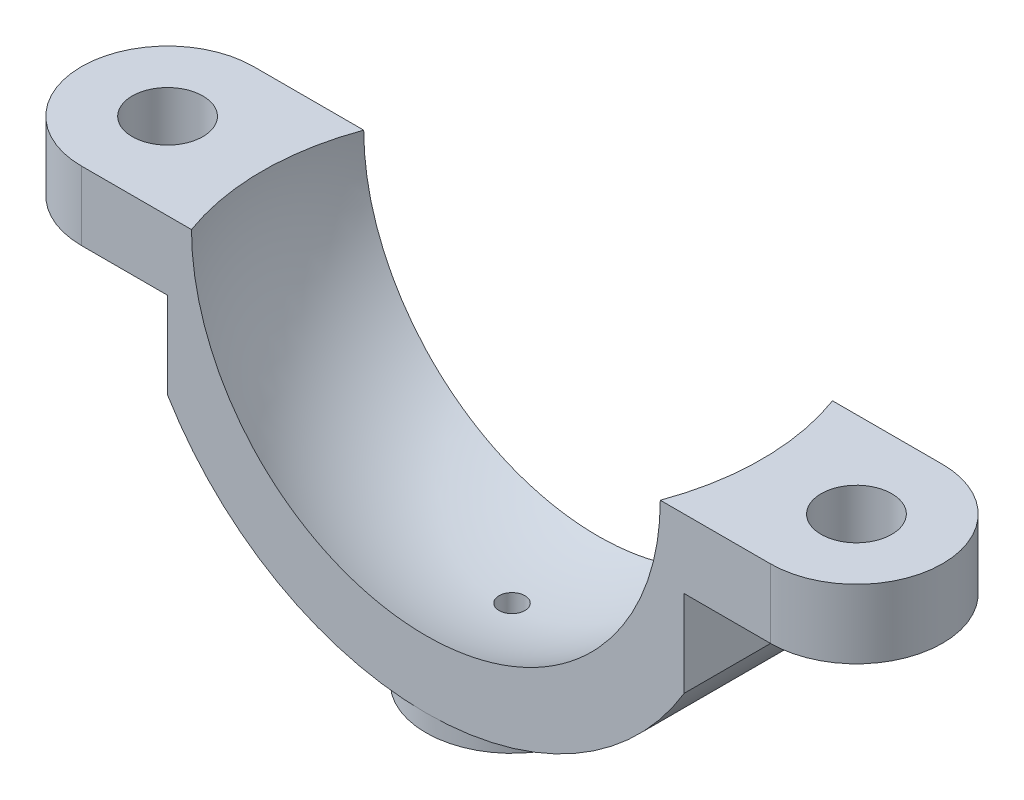
ISO-10303-21;
HEADER;
FILE_DESCRIPTION(('STEP AP214'),'2;1');
FILE_NAME('part.step','',(''),(''),'','','');
FILE_SCHEMA(('AUTOMOTIVE_DESIGN { 1 0 10303 214 1 1 1 1 }'));
ENDSEC;
DATA;
#1=APPLICATION_CONTEXT('core data for automotive mechanical design processes');
#2=APPLICATION_PROTOCOL_DEFINITION('international standard','automotive_design',2000,#1);
#3=PRODUCT_CONTEXT('',#1,'mechanical');
#4=PRODUCT('Part','Part','',(#3));
#5=PRODUCT_RELATED_PRODUCT_CATEGORY('part','',(#4));
#6=PRODUCT_DEFINITION_FORMATION('','',#4);
#7=PRODUCT_DEFINITION_CONTEXT('part definition',#1,'design');
#8=PRODUCT_DEFINITION('design','',#6,#7);
#9=PRODUCT_DEFINITION_SHAPE('','',#8);
#10=(LENGTH_UNIT() NAMED_UNIT(*) SI_UNIT(.MILLI.,.METRE.));
#11=(NAMED_UNIT(*) PLANE_ANGLE_UNIT() SI_UNIT($,.RADIAN.));
#12=(NAMED_UNIT(*) SI_UNIT($,.STERADIAN.) SOLID_ANGLE_UNIT());
#13=UNCERTAINTY_MEASURE_WITH_UNIT(LENGTH_MEASURE(1.E-05),#10,'distance_accuracy_value','');
#14=(GEOMETRIC_REPRESENTATION_CONTEXT(3) GLOBAL_UNCERTAINTY_ASSIGNED_CONTEXT((#13)) GLOBAL_UNIT_ASSIGNED_CONTEXT((#10,
#11,#12)) REPRESENTATION_CONTEXT('',''));
#15=CARTESIAN_POINT('',(0.,0.,0.));
#16=DIRECTION('',(0.,0.,1.));
#17=DIRECTION('',(1.,0.,0.));
#18=AXIS2_PLACEMENT_3D('',#15,#16,#17);
#19=CARTESIAN_POINT('',(0.,-40.,10.));
#20=DIRECTION('',(0.,0.,1.));
#21=DIRECTION('',(1.,0.,0.));
#22=AXIS2_PLACEMENT_3D('',#19,#20,#21);
#23=PLANE('',#22);
#24=DIRECTION('',(0.,-1.,0.));
#25=VECTOR('',#24,1.);
#26=CARTESIAN_POINT('',(30.,28.2842712474619,10.));
#27=LINE('',#26,#25);
#28=CARTESIAN_POINT('',(30.,-8.,10.));
#29=VERTEX_POINT('',#28);
#30=CARTESIAN_POINT('',(30.,-18.02775637732,10.));
#31=VERTEX_POINT('',#30);
#32=EDGE_CURVE('E183',#29,#31,#27,.T.);
#33=ORIENTED_EDGE('',*,*,#32,.F.);
#34=DIRECTION('',(-1.,0.,0.));
#35=VECTOR('',#34,1.);
#36=CARTESIAN_POINT('',(40.,-8.,10.));
#37=LINE('',#36,#35);
#38=CARTESIAN_POINT('',(40.,-8.,10.));
#39=VERTEX_POINT('',#38);
#40=EDGE_CURVE('E195',#39,#29,#37,.T.);
#41=ORIENTED_EDGE('',*,*,#40,.F.);
#42=DIRECTION('',(0.,1.,0.));
#43=VECTOR('',#42,1.);
#44=CARTESIAN_POINT('',(40.,-40.,10.));
#45=LINE('',#44,#43);
#46=CARTESIAN_POINT('',(40.,0.,10.));
#47=VERTEX_POINT('',#46);
#48=EDGE_CURVE('E264',#39,#47,#45,.T.);
#49=ORIENTED_EDGE('',*,*,#48,.T.);
#50=DIRECTION('',(1.,0.,0.));
#51=VECTOR('',#50,1.);
#52=CARTESIAN_POINT('',(0.,0.,10.));
#53=LINE('',#52,#51);
#54=CARTESIAN_POINT('',(27.2213151776324,0.,10.));
#55=VERTEX_POINT('',#54);
#56=EDGE_CURVE('E261',#55,#47,#53,.T.);
#57=ORIENTED_EDGE('',*,*,#56,.F.);
#58=CARTESIAN_POINT('',(0.,0.,10.));
#59=DIRECTION('',(0.,0.,-1.));
#60=DIRECTION('',(-1.,0.,0.));
#61=AXIS2_PLACEMENT_3D('',#58,#59,#60);
#62=CIRCLE('',#61,27.2213151776324);
#63=CARTESIAN_POINT('',(-27.2213151776324,0.,10.));
#64=VERTEX_POINT('',#63);
#65=EDGE_CURVE('E200',#64,#55,#62,.F.);
#66=ORIENTED_EDGE('',*,*,#65,.F.);
#67=DIRECTION('',(-1.,0.,0.));
#68=VECTOR('',#67,1.);
#69=CARTESIAN_POINT('',(0.,0.,10.));
#70=LINE('',#69,#68);
#71=CARTESIAN_POINT('',(-40.,0.,10.));
#72=VERTEX_POINT('',#71);
#73=EDGE_CURVE('E107',#64,#72,#70,.T.);
#74=ORIENTED_EDGE('',*,*,#73,.T.);
#75=DIRECTION('',(0.,1.,0.));
#76=VECTOR('',#75,1.);
#77=CARTESIAN_POINT('',(-40.,-40.,10.));
#78=LINE('',#77,#76);
#79=CARTESIAN_POINT('',(-40.,-8.,10.));
#80=VERTEX_POINT('',#79);
#81=EDGE_CURVE('E246',#80,#72,#78,.T.);
#82=ORIENTED_EDGE('',*,*,#81,.F.);
#83=DIRECTION('',(1.,0.,0.));
#84=VECTOR('',#83,1.);
#85=CARTESIAN_POINT('',(-40.,-8.,10.));
#86=LINE('',#85,#84);
#87=CARTESIAN_POINT('',(-30.,-8.,10.));
#88=VERTEX_POINT('',#87);
#89=EDGE_CURVE('E227',#80,#88,#86,.T.);
#90=ORIENTED_EDGE('',*,*,#89,.T.);
#91=DIRECTION('',(0.,-1.,0.));
#92=VECTOR('',#91,1.);
#93=CARTESIAN_POINT('',(-30.,28.2842712474619,10.));
#94=LINE('',#93,#92);
#95=CARTESIAN_POINT('',(-30.,-18.02775637732,10.));
#96=VERTEX_POINT('',#95);
#97=EDGE_CURVE('E224',#88,#96,#94,.T.);
#98=ORIENTED_EDGE('',*,*,#97,.T.);
#99=CARTESIAN_POINT('',(0.,0.,10.));
#100=DIRECTION('',(0.,0.,-1.));
#101=DIRECTION('',(-1.,0.,0.));
#102=AXIS2_PLACEMENT_3D('',#99,#100,#101);
#103=CIRCLE('',#102,35.);
#104=CARTESIAN_POINT('',(0.,-35.,10.));
#105=VERTEX_POINT('',#104);
#106=EDGE_CURVE('E205',#105,#96,#103,.T.);
#107=ORIENTED_EDGE('',*,*,#106,.F.);
#108=EDGE_CURVE('E209',#31,#105,#103,.T.);
#109=ORIENTED_EDGE('',*,*,#108,.F.);
#110=EDGE_LOOP('',(#33,#41,#49,#57,#66,#74,#82,#90,#98,#107,#109));
#111=FACE_BOUND('',#110,.T.);
#112=ADVANCED_FACE('F85',(#111),#23,.T.);
#113=CARTESIAN_POINT('',(0.,-40.,-10.));
#114=DIRECTION('',(0.,0.,-1.));
#115=DIRECTION('',(-1.,0.,0.));
#116=AXIS2_PLACEMENT_3D('',#113,#114,#115);
#117=PLANE('',#116);
#118=DIRECTION('',(1.,0.,0.));
#119=VECTOR('',#118,1.);
#120=CARTESIAN_POINT('',(30.,-8.,-10.));
#121=LINE('',#120,#119);
#122=CARTESIAN_POINT('',(30.,-8.,-10.));
#123=VERTEX_POINT('',#122);
#124=CARTESIAN_POINT('',(40.,-8.,-10.));
#125=VERTEX_POINT('',#124);
#126=EDGE_CURVE('E182',#123,#125,#121,.T.);
#127=ORIENTED_EDGE('',*,*,#126,.F.);
#128=DIRECTION('',(0.,-1.,0.));
#129=VECTOR('',#128,1.);
#130=CARTESIAN_POINT('',(30.,28.2842712474619,-10.));
#131=LINE('',#130,#129);
#132=CARTESIAN_POINT('',(30.,-18.02775637732,-10.));
#133=VERTEX_POINT('',#132);
#134=EDGE_CURVE('E171',#123,#133,#131,.T.);
#135=ORIENTED_EDGE('',*,*,#134,.T.);
#136=CARTESIAN_POINT('',(0.,0.,-10.));
#137=DIRECTION('',(0.,0.,1.));
#138=DIRECTION('',(1.,0.,0.));
#139=AXIS2_PLACEMENT_3D('',#136,#137,#138);
#140=CIRCLE('',#139,35.);
#141=CARTESIAN_POINT('',(0.,-35.,-10.));
#142=VERTEX_POINT('',#141);
#143=EDGE_CURVE('E213',#142,#133,#140,.T.);
#144=ORIENTED_EDGE('',*,*,#143,.F.);
#145=CARTESIAN_POINT('',(-30.,-18.02775637732,-10.));
#146=VERTEX_POINT('',#145);
#147=EDGE_CURVE('E210',#146,#142,#140,.T.);
#148=ORIENTED_EDGE('',*,*,#147,.F.);
#149=DIRECTION('',(0.,-1.,0.));
#150=VECTOR('',#149,1.);
#151=CARTESIAN_POINT('',(-30.,28.2842712474619,-10.));
#152=LINE('',#151,#150);
#153=CARTESIAN_POINT('',(-30.,-8.,-10.));
#154=VERTEX_POINT('',#153);
#155=EDGE_CURVE('E237',#154,#146,#152,.T.);
#156=ORIENTED_EDGE('',*,*,#155,.F.);
#157=DIRECTION('',(-1.,0.,0.));
#158=VECTOR('',#157,1.);
#159=CARTESIAN_POINT('',(-30.,-8.,-10.));
#160=LINE('',#159,#158);
#161=CARTESIAN_POINT('',(-40.,-8.,-10.));
#162=VERTEX_POINT('',#161);
#163=EDGE_CURVE('E234',#154,#162,#160,.T.);
#164=ORIENTED_EDGE('',*,*,#163,.T.);
#165=DIRECTION('',(0.,1.,0.));
#166=VECTOR('',#165,1.);
#167=CARTESIAN_POINT('',(-40.,-40.,-10.));
#168=LINE('',#167,#166);
#169=CARTESIAN_POINT('',(-40.,0.,-10.));
#170=VERTEX_POINT('',#169);
#171=EDGE_CURVE('E247',#162,#170,#168,.T.);
#172=ORIENTED_EDGE('',*,*,#171,.T.);
#173=DIRECTION('',(1.,0.,0.));
#174=VECTOR('',#173,1.);
#175=CARTESIAN_POINT('',(0.,0.,-10.));
#176=LINE('',#175,#174);
#177=CARTESIAN_POINT('',(-27.2213151776324,0.,-10.));
#178=VERTEX_POINT('',#177);
#179=EDGE_CURVE('E244',#170,#178,#176,.T.);
#180=ORIENTED_EDGE('',*,*,#179,.T.);
#181=CARTESIAN_POINT('',(0.,0.,-10.));
#182=DIRECTION('',(0.,0.,1.));
#183=DIRECTION('',(1.,0.,0.));
#184=AXIS2_PLACEMENT_3D('',#181,#182,#183);
#185=CIRCLE('',#184,27.2213151776324);
#186=CARTESIAN_POINT('',(27.2213151776324,0.,-10.));
#187=VERTEX_POINT('',#186);
#188=EDGE_CURVE('E208',#187,#178,#185,.F.);
#189=ORIENTED_EDGE('',*,*,#188,.F.);
#190=DIRECTION('',(-1.,0.,0.));
#191=VECTOR('',#190,1.);
#192=CARTESIAN_POINT('',(0.,0.,-10.));
#193=LINE('',#192,#191);
#194=CARTESIAN_POINT('',(40.,0.,-10.));
#195=VERTEX_POINT('',#194);
#196=EDGE_CURVE('E100',#195,#187,#193,.T.);
#197=ORIENTED_EDGE('',*,*,#196,.F.);
#198=DIRECTION('',(0.,1.,0.));
#199=VECTOR('',#198,1.);
#200=CARTESIAN_POINT('',(40.,-40.,-10.));
#201=LINE('',#200,#199);
#202=EDGE_CURVE('E187',#125,#195,#201,.T.);
#203=ORIENTED_EDGE('',*,*,#202,.F.);
#204=EDGE_LOOP('',(#127,#135,#144,#148,#156,#164,#172,#180,#189,#197,#203));
#205=FACE_BOUND('',#204,.T.);
#206=ADVANCED_FACE('F186',(#205),#117,.T.);
#207=CARTESIAN_POINT('',(0.,0.,0.));
#208=DIRECTION('',(0.,-1.,0.));
#209=DIRECTION('',(-1.,0.,0.));
#210=AXIS2_PLACEMENT_3D('',#207,#208,#209);
#211=SPHERICAL_SURFACE('',#210,29.);
#212=CARTESIAN_POINT('',(0.,-28.9611809151492,0.));
#213=DIRECTION('',(0.,1.,0.));
#214=DIRECTION('',(0.,0.,1.));
#215=AXIS2_PLACEMENT_3D('',#212,#213,#214);
#216=CIRCLE('',#215,1.5);
#217=CARTESIAN_POINT('',(0.,-28.9611809151492,1.5));
#218=VERTEX_POINT('',#217);
#219=EDGE_CURVE('E197',#218,#218,#216,.F.);
#220=ORIENTED_EDGE('',*,*,#219,.T.);
#221=EDGE_LOOP('',(#220));
#222=FACE_BOUND('',#221,.T.);
#223=CARTESIAN_POINT('',(0.,0.,0.));
#224=DIRECTION('',(0.,1.,0.));
#225=DIRECTION('',(0.,0.,1.));
#226=AXIS2_PLACEMENT_3D('',#223,#224,#225);
#227=CIRCLE('',#226,29.);
#228=EDGE_CURVE('E13',#64,#178,#227,.F.);
#229=ORIENTED_EDGE('',*,*,#228,.F.);
#230=ORIENTED_EDGE('',*,*,#65,.T.);
#231=EDGE_CURVE('E89',#187,#55,#227,.F.);
#232=ORIENTED_EDGE('',*,*,#231,.F.);
#233=ORIENTED_EDGE('',*,*,#188,.T.);
#234=EDGE_LOOP('',(#229,#230,#232,#233));
#235=FACE_BOUND('',#234,.T.);
#236=ADVANCED_FACE('F320',(#222,#235),#211,.F.);
#237=CARTESIAN_POINT('',(0.,0.,19.));
#238=DIRECTION('',(0.,0.,-1.));
#239=DIRECTION('',(-1.,0.,0.));
#240=AXIS2_PLACEMENT_3D('',#237,#238,#239);
#241=CYLINDRICAL_SURFACE('',#240,35.);
#242=DIRECTION('',(0.,0.,-1.));
#243=VECTOR('',#242,1.);
#244=CARTESIAN_POINT('',(30.,-18.02775637732,19.));
#245=LINE('',#244,#243);
#246=EDGE_CURVE('E178',#133,#31,#245,.F.);
#247=ORIENTED_EDGE('',*,*,#246,.T.);
#248=ORIENTED_EDGE('',*,*,#108,.T.);
#249=CARTESIAN_POINT('',(0.,-35.,-10.));
#250=CARTESIAN_POINT('',(0.274901556005326,-34.9999995349942,-9.99999924967954));
#251=CARTESIAN_POINT('',(0.549816834208974,-34.9967534260573,-9.98865495098646));
#252=CARTESIAN_POINT('',(1.09763859312636,-34.9838573930638,-9.94337682242785));
#253=CARTESIAN_POINT('',(1.37054493873051,-34.9742070422009,-9.90944148699843));
#254=CARTESIAN_POINT('',(1.91244857857752,-34.9487645309711,-9.81926738040531));
#255=CARTESIAN_POINT('',(2.18144454565831,-34.9329703336728,-9.76302121218429));
#256=CARTESIAN_POINT('',(2.71351961664384,-34.8956722555232,-9.62871222889092));
#257=CARTESIAN_POINT('',(2.97659879667573,-34.8741684481792,-9.55064969468818));
#258=CARTESIAN_POINT('',(3.49466661736326,-34.8260663007465,-9.37348104058914));
#259=CARTESIAN_POINT('',(3.74966621721336,-34.7994752390279,-9.27440496317931));
#260=CARTESIAN_POINT('',(4.25027905548096,-34.7418856596069,-9.05592170150173));
#261=CARTESIAN_POINT('',(4.49589227439498,-34.710887132747,-8.93651447499174));
#262=CARTESIAN_POINT('',(4.97613714950347,-34.6452997477994,-8.67827075204289));
#263=CARTESIAN_POINT('',(5.21077010660211,-34.6107113166018,-8.53943656506078));
#264=CARTESIAN_POINT('',(5.66772265114487,-34.5388251629476,-8.24324484564326));
#265=CARTESIAN_POINT('',(5.89003746970788,-34.501526403946,-8.08588021194566));
#266=CARTESIAN_POINT('',(6.32592675936229,-34.4243050679413,-7.74984704946557));
#267=CARTESIAN_POINT('',(6.53917776732202,-34.3843416459844,-7.57076821556402));
#268=CARTESIAN_POINT('',(6.95002921590175,-34.3036579972133,-7.19545320300337));
#269=CARTESIAN_POINT('',(7.14762246196098,-34.2629374329894,-6.99920922328957));
#270=CARTESIAN_POINT('',(7.52582469969113,-34.1818574635198,-6.59085878226957));
#271=CARTESIAN_POINT('',(7.70643113585794,-34.141498113439,-6.37874994283535));
#272=CARTESIAN_POINT('',(8.04936626216633,-34.0622763301484,-5.94013183951048));
#273=CARTESIAN_POINT('',(8.21170312342184,-34.0234132328936,-5.71362908482932));
#274=CARTESIAN_POINT('',(8.52023034045641,-33.9474806370998,-5.24275878995685));
#275=CARTESIAN_POINT('',(8.66601943386889,-33.9104645422293,-4.99811944544618));
#276=CARTESIAN_POINT('',(8.93634679576843,-33.8402306801851,-4.49696892337275));
#277=CARTESIAN_POINT('',(9.06089343601826,-33.8070114183702,-4.24046247360146));
#278=CARTESIAN_POINT('',(9.28780934205017,-33.7453764473668,-3.71724488228859));
#279=CARTESIAN_POINT('',(9.39017775956497,-33.7169609219197,-3.45053335088443));
#280=CARTESIAN_POINT('',(9.57184841023875,-33.6658377995533,-2.9088348202587));
#281=CARTESIAN_POINT('',(9.65115138156788,-33.6431300199704,-2.63384808618169));
#282=CARTESIAN_POINT('',(9.78424265867768,-33.6046614796328,-2.08478648218745));
#283=CARTESIAN_POINT('',(9.83863283932791,-33.588737575942,-1.81086889625427));
#284=CARTESIAN_POINT('',(9.92433812994148,-33.5635146459401,-1.25914388352105));
#285=CARTESIAN_POINT('',(9.95565360015433,-33.5542155162009,-0.981336517518456));
#286=CARTESIAN_POINT('',(9.99491227272419,-33.5425423887174,-0.423982433591654));
#287=CARTESIAN_POINT('',(10.0028598891722,-33.5401670830921,-0.144436054158849));
#288=CARTESIAN_POINT('',(9.99531923955364,-33.5424150939696,0.414309238328165));
#289=CARTESIAN_POINT('',(9.97983142163665,-33.5470382766421,0.693508157924577));
#290=CARTESIAN_POINT('',(9.9264511409617,-33.5628709479271,1.24039883423783));
#291=CARTESIAN_POINT('',(9.88930230639193,-33.5738617577482,1.50816991962072));
#292=CARTESIAN_POINT('',(9.79353170780366,-33.6019229058669,2.03951174164953));
#293=CARTESIAN_POINT('',(9.73491047739392,-33.6189930930863,2.30308258250554));
#294=CARTESIAN_POINT('',(9.59669567556859,-33.6587075479779,2.82419774404081));
#295=CARTESIAN_POINT('',(9.51710455259157,-33.6813511648778,3.08174276447318));
#296=CARTESIAN_POINT('',(9.33755032554643,-33.7315703667606,3.58923838067531));
#297=CARTESIAN_POINT('',(9.23757954249698,-33.7591478103106,3.83918607288606));
#298=CARTESIAN_POINT('',(9.01669015254577,-33.8188193066451,4.33281789283186));
#299=CARTESIAN_POINT('',(8.89552938190959,-33.8509646647343,4.57638741235577));
#300=CARTESIAN_POINT('',(8.63396148582359,-33.9186225401587,5.05257670270576));
#301=CARTESIAN_POINT('',(8.49354775248505,-33.9541362122512,5.28519267713645));
#302=CARTESIAN_POINT('',(8.19446313906339,-34.0275546504394,5.73797803205607));
#303=CARTESIAN_POINT('',(8.03579198460907,-34.0654594524651,5.95814722542152));
#304=CARTESIAN_POINT('',(7.70121966473613,-34.1426519739269,6.38472376752835));
#305=CARTESIAN_POINT('',(7.52531805836191,-34.1819397287386,6.59113076384515));
#306=CARTESIAN_POINT('',(7.15039632731337,-34.2623694377239,6.99649273715611));
#307=CARTESIAN_POINT('',(6.95075264384343,-34.3035252288492,7.1948687178037));
#308=CARTESIAN_POINT('',(6.53544484829141,-34.3850653609806,7.57410136173077));
#309=CARTESIAN_POINT('',(6.31978597427865,-34.4254499488378,7.75496370897163));
#310=CARTESIAN_POINT('',(5.87367708568067,-34.5043655059927,8.09809462745592));
#311=CARTESIAN_POINT('',(5.64322075432854,-34.5428956712261,8.26035517448905));
#312=CARTESIAN_POINT('',(5.16918751072518,-34.6170047590679,8.56497773523647));
#313=CARTESIAN_POINT('',(4.92561577633336,-34.6525848324623,8.70734752302168));
#314=CARTESIAN_POINT('',(4.42542654252326,-34.7200178977535,8.97196270709409));
#315=CARTESIAN_POINT('',(4.16874126057557,-34.7518479496296,9.09408592967774));
#316=CARTESIAN_POINT('',(3.64542161894955,-34.8106337376445,9.31620625953586));
#317=CARTESIAN_POINT('',(3.3787871781783,-34.8375894340433,9.41620318641881));
#318=CARTESIAN_POINT('',(2.83754701708412,-34.8858441393398,9.59319420489764));
#319=CARTESIAN_POINT('',(2.56294294198027,-34.9071443066569,9.6701930075924));
#320=CARTESIAN_POINT('',(2.00776806951057,-34.9434720173998,9.80051835203463));
#321=CARTESIAN_POINT('',(1.72719746843721,-34.9584997668471,9.85384567129056));
#322=CARTESIAN_POINT('',(1.1715290272677,-34.9814564117019,9.93497622883892));
#323=CARTESIAN_POINT('',(0.896553866474546,-34.989602141161,9.96355985855155));
#324=CARTESIAN_POINT('',(0.345067646649964,-34.9993853927253,9.99786233572984));
#325=CARTESIAN_POINT('',(0.0685566213768953,-35.0010230573156,10.0035816837773));
#326=CARTESIAN_POINT('',(-0.48391868379708,-34.9977446058211,9.99210470998283));
#327=CARTESIAN_POINT('',(-0.759883020049632,-34.9928292046398,9.97491088784188));
#328=CARTESIAN_POINT('',(-1.30925255364139,-34.9765832409262,9.91776811669901));
#329=CARTESIAN_POINT('',(-1.58265776637141,-34.9652527170004,9.8778193046374));
#330=CARTESIAN_POINT('',(-2.11938308034803,-34.9367853339199,9.77656760962569));
#331=CARTESIAN_POINT('',(-2.38279515674155,-34.9197715263781,9.71571656073462));
#332=CARTESIAN_POINT('',(-2.90354771404353,-34.8803329081056,9.57299980563757));
#333=CARTESIAN_POINT('',(-3.16088597663149,-34.8579061529916,9.49112654737372));
#334=CARTESIAN_POINT('',(-3.66765986565095,-34.8082331236944,9.30703723748194));
#335=CARTESIAN_POINT('',(-3.91709642523066,-34.7809874211233,9.20482359840229));
#336=CARTESIAN_POINT('',(-4.40651944086204,-34.7223752235505,8.98081411145692));
#337=CARTESIAN_POINT('',(-4.64650545228472,-34.6910085349651,8.85901734361201));
#338=CARTESIAN_POINT('',(-5.12061162673057,-34.6242383471649,8.59387518611736));
#339=CARTESIAN_POINT('',(-5.35449296067473,-34.5887622610422,8.45012101236512));
#340=CARTESIAN_POINT('',(-5.80938889613202,-34.5152733800743,8.14408707020698));
#341=CARTESIAN_POINT('',(-6.03040296540175,-34.4772604804353,7.98180653629496));
#342=CARTESIAN_POINT('',(-6.45824398273693,-34.3996855714484,7.63977140602325));
#343=CARTESIAN_POINT('',(-6.6650683176308,-34.3601232788613,7.46001360571704));
#344=CARTESIAN_POINT('',(-7.06322625388594,-34.2804909969693,7.08419239384804));
#345=CARTESIAN_POINT('',(-7.25455959472322,-34.2404209991389,6.88812870816898));
#346=CARTESIAN_POINT('',(-7.6265940410285,-34.1595154417031,6.47418201031811));
#347=CARTESIAN_POINT('',(-7.80673615052604,-34.1186982362244,6.25579256147538));
#348=CARTESIAN_POINT('',(-8.14792419429743,-34.03883115914,5.80442357654746));
#349=CARTESIAN_POINT('',(-8.30897846525841,-33.9997805206214,5.57145047837564));
#350=CARTESIAN_POINT('',(-8.61099897752669,-33.9245476943363,5.09224322256546));
#351=CARTESIAN_POINT('',(-8.75195677962637,-33.8883667144525,4.8460035532895));
#352=CARTESIAN_POINT('',(-9.01258132962313,-33.8199871701867,4.34209667369553));
#353=CARTESIAN_POINT('',(-9.13225679618833,-33.7877869766639,4.08443419721887));
#354=CARTESIAN_POINT('',(-9.34885994271781,-33.7284949434232,3.56071630807572));
#355=CARTESIAN_POINT('',(-9.44590158865571,-33.7013776521628,3.29471094721796));
#356=CARTESIAN_POINT('',(-9.61719600143262,-33.6528969729376,2.75494278425974));
#357=CARTESIAN_POINT('',(-9.69144877180137,-33.6315335840815,2.48117998336083));
#358=CARTESIAN_POINT('',(-9.81647741141718,-33.5952528631857,1.9279940930322));
#359=CARTESIAN_POINT('',(-9.8672592430445,-33.5803338941172,1.64857245997692));
#360=CARTESIAN_POINT('',(-9.94489151234601,-33.5574250977651,1.08614552295311));
#361=CARTESIAN_POINT('',(-9.97174275400543,-33.5494350376944,0.803140339703503));
#362=CARTESIAN_POINT('',(-10.0006980595713,-33.5408146926477,0.246489419160142));
#363=CARTESIAN_POINT('',(-10.0036988240839,-33.5399177366807,-0.0271059355002858));
#364=CARTESIAN_POINT('',(-9.9872792132283,-33.5448107573299,-0.57355795713377));
#365=CARTESIAN_POINT('',(-9.96785943216973,-33.5506005566979,-0.846414643494815));
#366=CARTESIAN_POINT('',(-9.90677666105821,-33.5686875813787,-1.38939397122278));
#367=CARTESIAN_POINT('',(-9.86511454604278,-33.5809845506922,-1.65951671971982));
#368=CARTESIAN_POINT('',(-9.75991646407293,-33.6117096790817,-2.19511138841406));
#369=CARTESIAN_POINT('',(-9.69638038925876,-33.6301378683904,-2.46058328567129));
#370=CARTESIAN_POINT('',(-9.54875094611983,-33.672350352576,-2.98229535281214));
#371=CARTESIAN_POINT('',(-9.46487888929797,-33.6960767819299,-3.2386029281119));
#372=CARTESIAN_POINT('',(-9.27687660192876,-33.7483195836135,-3.74327369052698));
#373=CARTESIAN_POINT('',(-9.17273910125669,-33.7768376744244,-3.99163398925366));
#374=CARTESIAN_POINT('',(-8.94501049329059,-33.8378585821611,-4.47873493013777));
#375=CARTESIAN_POINT('',(-8.82142062117069,-33.8703611460545,-4.71747618187115));
#376=CARTESIAN_POINT('',(-8.5556443579381,-33.9384702309865,-5.18391830135821));
#377=CARTESIAN_POINT('',(-8.41345692322027,-33.9740769261765,-5.4116185485606));
#378=CARTESIAN_POINT('',(-8.10638321721883,-34.0486759443049,-5.86202157558044));
#379=CARTESIAN_POINT('',(-7.94089768695976,-34.0877416056887,-6.08430382996988));
#380=CARTESIAN_POINT('',(-7.5921795880741,-34.1671007893327,-6.51424808554766));
#381=CARTESIAN_POINT('',(-7.40894667258037,-34.2073943355809,-6.72190980084503));
#382=CARTESIAN_POINT('',(-7.02586237623383,-34.2881258662738,-7.12136610221688));
#383=CARTESIAN_POINT('',(-6.82600684312653,-34.328563884378,-7.31315669974563));
#384=CARTESIAN_POINT('',(-6.4109755686932,-34.4084879627462,-7.67958476501529));
#385=CARTESIAN_POINT('',(-6.1958001208401,-34.4479740412266,-7.85422256118805));
#386=CARTESIAN_POINT('',(-5.74569910795143,-34.5259386331858,-8.18948796591788));
#387=CARTESIAN_POINT('',(-5.5104061960464,-34.5643645060219,-8.34963513100442));
#388=CARTESIAN_POINT('',(-5.02674726936587,-34.6380082630153,-8.64943533942895));
#389=CARTESIAN_POINT('',(-4.77838606147991,-34.6732273138958,-8.78909584772451));
#390=CARTESIAN_POINT('',(-4.27027028054489,-34.7394647435523,-9.04687394413956));
#391=CARTESIAN_POINT('',(-4.01051884161307,-34.7704842683796,-9.16499741278403));
#392=CARTESIAN_POINT('',(-3.48140205835312,-34.8274404222058,-9.37876491402004));
#393=CARTESIAN_POINT('',(-3.21203780889826,-34.8533776278967,-9.47441149731556));
#394=CARTESIAN_POINT('',(-2.70177833764652,-34.8963756402951,-9.63129966908211));
#395=CARTESIAN_POINT('',(-2.4618233893793,-34.9141564288628,-9.69541719554452));
#396=CARTESIAN_POINT('',(-1.97743233435039,-34.9449375290137,-9.80568555839008));
#397=CARTESIAN_POINT('',(-1.73299491879246,-34.9579364202669,-9.85183105691824));
#398=CARTESIAN_POINT('',(-1.24117120949031,-34.9788517233327,-9.92579104085097));
#399=CARTESIAN_POINT('',(-0.993785218650304,-34.986768652704,-9.95360739294526));
#400=CARTESIAN_POINT('',(-0.49760290069416,-34.9973421259512,-9.99070912783732));
#401=CARTESIAN_POINT('',(-0.248807070714872,-35.000000420866,-10.0000006790978));
#402=CARTESIAN_POINT('',(0.,-35.,-10.));
#403=B_SPLINE_CURVE_WITH_KNOTS('',3,(#249,#250,#251,#252,#253,#254,#255,#256,#257,#258,#259,
#260,#261,#262,#263,#264,#265,#266,#267,#268,#269,#270,#271,#272,#273,#274,#275,#276,#277,#278,
#279,#280,#281,#282,#283,#284,#285,#286,#287,#288,#289,#290,#291,#292,#293,#294,#295,#296,#297,
#298,#299,#300,#301,#302,#303,#304,#305,#306,#307,#308,#309,#310,#311,#312,#313,#314,#315,#316,
#317,#318,#319,#320,#321,#322,#323,#324,#325,#326,#327,#328,#329,#330,#331,#332,#333,#334,#335,
#336,#337,#338,#339,#340,#341,#342,#343,#344,#345,#346,#347,#348,#349,#350,#351,#352,#353,#354,
#355,#356,#357,#358,#359,#360,#361,#362,#363,#364,#365,#366,#367,#368,#369,#370,#371,#372,#373,
#374,#375,#376,#377,#378,#379,#380,#381,#382,#383,#384,#385,#386,#387,#388,#389,#390,#391,#392,
#393,#394,#395,#396,#397,#398,#399,#400,#401,#402),.UNSPECIFIED.,.T.,.F.,(4,2,2,2,2,2,2,2,2,2,2,
2,2,2,2,2,2,2,2,2,2,2,2,2,2,2,2,2,2,2,2,2,2,2,2,2,2,2,2,2,2,2,2,2,2,2,2,2,2,2,2,2,2,2,2,2,2,2,2,
2,2,2,2,2,2,2,2,2,2,2,2,2,2,2,2,2,4),(0.,0.824476293243495,1.64900753863597,2.47381238249173,
3.29860660808281,4.12222950216585,4.94585410751966,5.76938088429255,6.59322428748663,
7.4362252883258,8.27961141901586,9.12312422686596,9.96625825945144,10.8267518093041,
11.6869054465494,12.5470919769362,13.4072509754946,14.245362981385,15.0834619021349,
15.9214024992868,16.7593270729229,17.5700506587097,18.3807540986374,19.1913629229835,
20.0022777481984,20.8231506027146,21.6443059009046,22.4654735409689,23.2866622015568,
24.1389767473028,24.9910137449999,25.8434169116183,26.6954859888174,27.5525230006538,
28.4095669994937,29.2664353147641,30.1232754834392,30.9519889936749,31.7806843602755,
32.6092893281644,33.4378893095329,34.2496007799973,35.0616042601895,35.8735114869609,
36.6854568667832,37.5149482124367,38.3444738449486,39.1741518345254,40.0038437745389,
40.8609073507723,41.7175952108682,42.5746417710524,43.431336414738,44.283619520394,
45.1359024940407,45.9879688409892,46.8400065603702,47.6598513779599,48.4796744641176,
49.2994652999233,50.1192601781473,50.930505076594,51.7420415433137,52.5535265003877,
53.3650570136188,54.2036764473375,55.0423122749222,55.8811582227384,56.7199881056888,
57.5805593547237,58.4408162444477,59.3008378946593,60.1607619013992,60.9070795655756,
61.6536187241199,62.4000818413468,63.1462963567416),.UNSPECIFIED.);
#404=EDGE_CURVE('E273',#142,#105,#403,.T.);
#405=ORIENTED_EDGE('',*,*,#404,.F.);
#406=ORIENTED_EDGE('',*,*,#143,.T.);
#407=EDGE_LOOP('',(#247,#248,#405,#406));
#408=FACE_BOUND('',#407,.T.);
#409=ADVANCED_FACE('F337',(#408),#241,.T.);
#410=CARTESIAN_POINT('',(0.,-37.,0.));
#411=DIRECTION('',(0.,1.,0.));
#412=DIRECTION('',(0.,0.,1.));
#413=AXIS2_PLACEMENT_3D('',#410,#411,#412);
#414=CYLINDRICAL_SURFACE('',#413,1.5);
#415=CARTESIAN_POINT('',(0.,-37.,0.));
#416=DIRECTION('',(0.,1.,0.));
#417=DIRECTION('',(0.,0.,1.));
#418=AXIS2_PLACEMENT_3D('',#415,#416,#417);
#419=CIRCLE('',#418,1.5);
#420=CARTESIAN_POINT('',(0.,-37.,1.5));
#421=VERTEX_POINT('',#420);
#422=EDGE_CURVE('E214',#421,#421,#419,.T.);
#423=ORIENTED_EDGE('',*,*,#422,.F.);
#424=EDGE_LOOP('',(#423));
#425=FACE_BOUND('',#424,.T.);
#426=ORIENTED_EDGE('',*,*,#219,.F.);
#427=EDGE_LOOP('',(#426));
#428=FACE_BOUND('',#427,.T.);
#429=ADVANCED_FACE('F348',(#425,#428),#414,.F.);
#430=CARTESIAN_POINT('',(0.,0.,19.));
#431=DIRECTION('',(0.,1.,0.));
#432=DIRECTION('',(0.,0.,1.));
#433=AXIS2_PLACEMENT_3D('',#430,#431,#432);
#434=PLANE('',#433);
#435=CARTESIAN_POINT('',(-40.,0.,0.));
#436=DIRECTION('',(0.,1.,0.));
#437=DIRECTION('',(0.,0.,-1.));
#438=AXIS2_PLACEMENT_3D('',#435,#436,#437);
#439=CIRCLE('',#438,4.1);
#440=CARTESIAN_POINT('',(-40.,0.,-4.1));
#441=VERTEX_POINT('',#440);
#442=EDGE_CURVE('E221',#441,#441,#439,.T.);
#443=ORIENTED_EDGE('',*,*,#442,.F.);
#444=EDGE_LOOP('',(#443));
#445=FACE_BOUND('',#444,.T.);
#446=CARTESIAN_POINT('',(-40.,0.,0.));
#447=DIRECTION('',(0.,-1.,0.));
#448=DIRECTION('',(0.,0.,1.));
#449=AXIS2_PLACEMENT_3D('',#446,#447,#448);
#450=CIRCLE('',#449,10.);
#451=EDGE_CURVE('E230',#72,#170,#450,.T.);
#452=ORIENTED_EDGE('',*,*,#451,.F.);
#453=ORIENTED_EDGE('',*,*,#73,.F.);
#454=ORIENTED_EDGE('',*,*,#228,.T.);
#455=ORIENTED_EDGE('',*,*,#179,.F.);
#456=EDGE_LOOP('',(#452,#453,#454,#455));
#457=FACE_BOUND('',#456,.T.);
#458=ADVANCED_FACE('F87',(#445,#457),#434,.T.);
#459=CARTESIAN_POINT('',(40.,0.,0.));
#460=DIRECTION('',(0.,-1.,0.));
#461=DIRECTION('',(0.,0.,-1.));
#462=AXIS2_PLACEMENT_3D('',#459,#460,#461);
#463=CIRCLE('',#462,4.1);
#464=CARTESIAN_POINT('',(40.,0.,-4.1));
#465=VERTEX_POINT('',#464);
#466=EDGE_CURVE('E251',#465,#465,#463,.T.);
#467=ORIENTED_EDGE('',*,*,#466,.T.);
#468=EDGE_LOOP('',(#467));
#469=FACE_BOUND('',#468,.T.);
#470=CARTESIAN_POINT('',(40.,0.,0.));
#471=DIRECTION('',(0.,1.,0.));
#472=DIRECTION('',(0.,0.,1.));
#473=AXIS2_PLACEMENT_3D('',#470,#471,#472);
#474=CIRCLE('',#473,10.);
#475=EDGE_CURVE('E257',#47,#195,#474,.T.);
#476=ORIENTED_EDGE('',*,*,#475,.T.);
#477=ORIENTED_EDGE('',*,*,#196,.T.);
#478=ORIENTED_EDGE('',*,*,#231,.T.);
#479=ORIENTED_EDGE('',*,*,#56,.T.);
#480=EDGE_LOOP('',(#476,#477,#478,#479));
#481=FACE_BOUND('',#480,.T.);
#482=ADVANCED_FACE('F328',(#469,#481),#434,.T.);
#483=EDGE_CURVE('E272',#105,#142,#403,.T.);
#484=ORIENTED_EDGE('',*,*,#483,.F.);
#485=ORIENTED_EDGE('',*,*,#106,.T.);
#486=DIRECTION('',(0.,0.,-1.));
#487=VECTOR('',#486,1.);
#488=CARTESIAN_POINT('',(-30.,-18.02775637732,19.));
#489=LINE('',#488,#487);
#490=EDGE_CURVE('E269',#146,#96,#489,.F.);
#491=ORIENTED_EDGE('',*,*,#490,.F.);
#492=ORIENTED_EDGE('',*,*,#147,.T.);
#493=EDGE_LOOP('',(#484,#485,#491,#492));
#494=FACE_BOUND('',#493,.T.);
#495=ADVANCED_FACE('F279',(#494),#241,.T.);
#496=CARTESIAN_POINT('',(0.,-8.,19.));
#497=DIRECTION('',(0.,1.,0.));
#498=DIRECTION('',(0.,0.,1.));
#499=AXIS2_PLACEMENT_3D('',#496,#497,#498);
#500=PLANE('',#499);
#501=CARTESIAN_POINT('',(-40.,-8.,0.));
#502=DIRECTION('',(0.,1.,0.));
#503=DIRECTION('',(0.,0.,-1.));
#504=AXIS2_PLACEMENT_3D('',#501,#502,#503);
#505=CIRCLE('',#504,4.1);
#506=CARTESIAN_POINT('',(-40.,-8.,-4.1));
#507=VERTEX_POINT('',#506);
#508=EDGE_CURVE('E220',#507,#507,#505,.T.);
#509=ORIENTED_EDGE('',*,*,#508,.T.);
#510=EDGE_LOOP('',(#509));
#511=FACE_BOUND('',#510,.T.);
#512=ORIENTED_EDGE('',*,*,#89,.F.);
#513=CARTESIAN_POINT('',(-40.,-8.,0.));
#514=DIRECTION('',(0.,1.,0.));
#515=DIRECTION('',(0.,0.,1.));
#516=AXIS2_PLACEMENT_3D('',#513,#514,#515);
#517=CIRCLE('',#516,10.);
#518=EDGE_CURVE('E231',#162,#80,#517,.T.);
#519=ORIENTED_EDGE('',*,*,#518,.F.);
#520=ORIENTED_EDGE('',*,*,#163,.F.);
#521=DIRECTION('',(0.,0.,1.));
#522=VECTOR('',#521,1.);
#523=CARTESIAN_POINT('',(-30.,-8.,10.));
#524=LINE('',#523,#522);
#525=EDGE_CURVE('E196',#154,#88,#524,.T.);
#526=ORIENTED_EDGE('',*,*,#525,.T.);
#527=EDGE_LOOP('',(#512,#519,#520,#526));
#528=FACE_BOUND('',#527,.T.);
#529=ADVANCED_FACE('F299',(#511,#528),#500,.F.);
#530=CARTESIAN_POINT('',(40.,-40.,0.));
#531=DIRECTION('',(0.,1.,0.));
#532=DIRECTION('',(0.,0.,1.));
#533=AXIS2_PLACEMENT_3D('',#530,#531,#532);
#534=CYLINDRICAL_SURFACE('',#533,10.);
#535=CARTESIAN_POINT('',(40.,-8.,0.));
#536=DIRECTION('',(0.,1.,0.));
#537=DIRECTION('',(0.,0.,1.));
#538=AXIS2_PLACEMENT_3D('',#535,#536,#537);
#539=CIRCLE('',#538,10.);
#540=EDGE_CURVE('E191',#125,#39,#539,.F.);
#541=ORIENTED_EDGE('',*,*,#540,.F.);
#542=ORIENTED_EDGE('',*,*,#202,.T.);
#543=ORIENTED_EDGE('',*,*,#475,.F.);
#544=ORIENTED_EDGE('',*,*,#48,.F.);
#545=EDGE_LOOP('',(#541,#542,#543,#544));
#546=FACE_BOUND('',#545,.T.);
#547=ADVANCED_FACE('F302',(#546),#534,.T.);
#548=CARTESIAN_POINT('',(30.,28.2842712474619,10.));
#549=DIRECTION('',(-1.,0.,0.));
#550=DIRECTION('',(0.,0.,1.));
#551=AXIS2_PLACEMENT_3D('',#548,#549,#550);
#552=PLANE('',#551);
#553=ORIENTED_EDGE('',*,*,#134,.F.);
#554=DIRECTION('',(0.,0.,-1.));
#555=VECTOR('',#554,1.);
#556=CARTESIAN_POINT('',(30.,-8.,10.));
#557=LINE('',#556,#555);
#558=EDGE_CURVE('E176',#29,#123,#557,.T.);
#559=ORIENTED_EDGE('',*,*,#558,.F.);
#560=ORIENTED_EDGE('',*,*,#32,.T.);
#561=ORIENTED_EDGE('',*,*,#246,.F.);
#562=EDGE_LOOP('',(#553,#559,#560,#561));
#563=FACE_BOUND('',#562,.T.);
#564=ADVANCED_FACE('F173',(#563),#552,.F.);
#565=CARTESIAN_POINT('',(0.,-8.,19.));
#566=DIRECTION('',(0.,1.,0.));
#567=DIRECTION('',(0.,0.,1.));
#568=AXIS2_PLACEMENT_3D('',#565,#566,#567);
#569=PLANE('',#568);
#570=CARTESIAN_POINT('',(40.,-8.,0.));
#571=DIRECTION('',(0.,-1.,0.));
#572=DIRECTION('',(0.,0.,-1.));
#573=AXIS2_PLACEMENT_3D('',#570,#571,#572);
#574=CIRCLE('',#573,4.1);
#575=CARTESIAN_POINT('',(40.,-8.,-4.1));
#576=VERTEX_POINT('',#575);
#577=EDGE_CURVE('E249',#576,#576,#574,.T.);
#578=ORIENTED_EDGE('',*,*,#577,.F.);
#579=EDGE_LOOP('',(#578));
#580=FACE_BOUND('',#579,.T.);
#581=ORIENTED_EDGE('',*,*,#126,.T.);
#582=ORIENTED_EDGE('',*,*,#540,.T.);
#583=ORIENTED_EDGE('',*,*,#40,.T.);
#584=ORIENTED_EDGE('',*,*,#558,.T.);
#585=EDGE_LOOP('',(#581,#582,#583,#584));
#586=FACE_BOUND('',#585,.T.);
#587=ADVANCED_FACE('F194',(#580,#586),#569,.F.);
#588=CARTESIAN_POINT('',(40.,0.,0.));
#589=DIRECTION('',(0.,-1.,0.));
#590=DIRECTION('',(0.,0.,-1.));
#591=AXIS2_PLACEMENT_3D('',#588,#589,#590);
#592=CYLINDRICAL_SURFACE('',#591,4.1);
#593=ORIENTED_EDGE('',*,*,#466,.F.);
#594=EDGE_LOOP('',(#593));
#595=FACE_BOUND('',#594,.T.);
#596=ORIENTED_EDGE('',*,*,#577,.T.);
#597=EDGE_LOOP('',(#596));
#598=FACE_BOUND('',#597,.T.);
#599=ADVANCED_FACE('F306',(#595,#598),#592,.F.);
#600=CARTESIAN_POINT('',(-40.,-40.,0.));
#601=DIRECTION('',(0.,1.,0.));
#602=DIRECTION('',(0.,0.,1.));
#603=AXIS2_PLACEMENT_3D('',#600,#601,#602);
#604=CYLINDRICAL_SURFACE('',#603,10.);
#605=ORIENTED_EDGE('',*,*,#171,.F.);
#606=ORIENTED_EDGE('',*,*,#518,.T.);
#607=ORIENTED_EDGE('',*,*,#81,.T.);
#608=ORIENTED_EDGE('',*,*,#451,.T.);
#609=EDGE_LOOP('',(#605,#606,#607,#608));
#610=FACE_BOUND('',#609,.T.);
#611=ADVANCED_FACE('F297',(#610),#604,.T.);
#612=CARTESIAN_POINT('',(-30.,28.2842712474619,10.));
#613=DIRECTION('',(-1.,0.,0.));
#614=DIRECTION('',(0.,0.,1.));
#615=AXIS2_PLACEMENT_3D('',#612,#613,#614);
#616=PLANE('',#615);
#617=ORIENTED_EDGE('',*,*,#97,.F.);
#618=ORIENTED_EDGE('',*,*,#525,.F.);
#619=ORIENTED_EDGE('',*,*,#155,.T.);
#620=ORIENTED_EDGE('',*,*,#490,.T.);
#621=EDGE_LOOP('',(#617,#618,#619,#620));
#622=FACE_BOUND('',#621,.T.);
#623=ADVANCED_FACE('F293',(#622),#616,.T.);
#624=CARTESIAN_POINT('',(-40.,0.,0.));
#625=DIRECTION('',(0.,-1.,0.));
#626=DIRECTION('',(0.,0.,-1.));
#627=AXIS2_PLACEMENT_3D('',#624,#625,#626);
#628=CYLINDRICAL_SURFACE('',#627,4.1);
#629=ORIENTED_EDGE('',*,*,#442,.T.);
#630=EDGE_LOOP('',(#629));
#631=FACE_BOUND('',#630,.T.);
#632=ORIENTED_EDGE('',*,*,#508,.F.);
#633=EDGE_LOOP('',(#632));
#634=FACE_BOUND('',#633,.T.);
#635=ADVANCED_FACE('F288',(#631,#634),#628,.F.);
#636=CARTESIAN_POINT('',(0.,0.001000000000001,0.));
#637=DIRECTION('',(0.,-1.,0.));
#638=DIRECTION('',(0.,0.,-1.));
#639=AXIS2_PLACEMENT_3D('',#636,#637,#638);
#640=CYLINDRICAL_SURFACE('',#639,10.);
#641=CARTESIAN_POINT('',(0.,-37.,0.));
#642=DIRECTION('',(0.,1.,0.));
#643=DIRECTION('',(0.,0.,1.));
#644=AXIS2_PLACEMENT_3D('',#641,#642,#643);
#645=CIRCLE('',#644,10.);
#646=CARTESIAN_POINT('',(0.,-37.,10.));
#647=VERTEX_POINT('',#646);
#648=EDGE_CURVE('E217',#647,#647,#645,.T.);
#649=ORIENTED_EDGE('',*,*,#648,.T.);
#650=EDGE_LOOP('',(#649));
#651=FACE_BOUND('',#650,.T.);
#652=ORIENTED_EDGE('',*,*,#404,.T.);
#653=ORIENTED_EDGE('',*,*,#483,.T.);
#654=EDGE_LOOP('',(#652,#653));
#655=FACE_BOUND('',#654,.T.);
#656=ADVANCED_FACE('F282',(#651,#655),#640,.T.);
#657=CARTESIAN_POINT('',(0.,-37.,0.));
#658=DIRECTION('',(0.,1.,0.));
#659=DIRECTION('',(0.,0.,1.));
#660=AXIS2_PLACEMENT_3D('',#657,#658,#659);
#661=PLANE('',#660);
#662=ORIENTED_EDGE('',*,*,#422,.T.);
#663=EDGE_LOOP('',(#662));
#664=FACE_BOUND('',#663,.T.);
#665=ORIENTED_EDGE('',*,*,#648,.F.);
#666=EDGE_LOOP('',(#665));
#667=FACE_BOUND('',#666,.T.);
#668=ADVANCED_FACE('F287',(#664,#667),#661,.F.);
#669=CLOSED_SHELL('',(#112,#206,#236,#409,#429,#458,#482,#495,#529,#547,#564,#587,#599,#611,
#623,#635,#656,#668));
#670=MANIFOLD_SOLID_BREP('B2',#669);
#671=ADVANCED_BREP_SHAPE_REPRESENTATION('',(#18,#670),#14);
#672=SHAPE_DEFINITION_REPRESENTATION(#9,#671);
ENDSEC;
END-ISO-10303-21;
